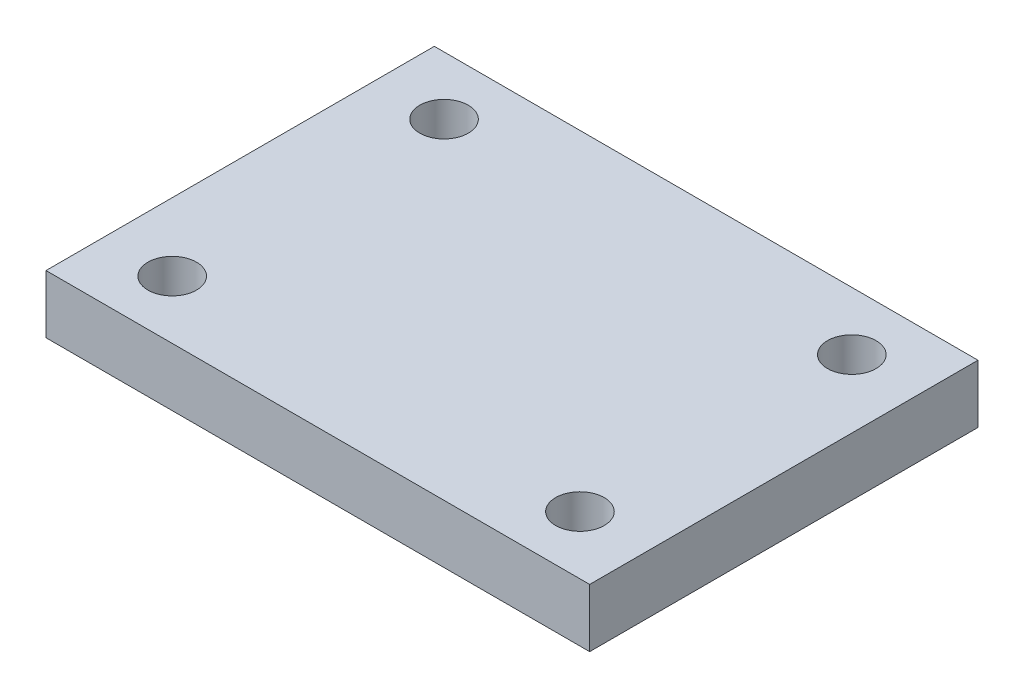
ISO-10303-21;
HEADER;
FILE_DESCRIPTION(('STEP AP214'),'2;1');
FILE_NAME('part.step','',(''),(''),'','','');
FILE_SCHEMA(('AUTOMOTIVE_DESIGN { 1 0 10303 214 1 1 1 1 }'));
ENDSEC;
DATA;
#1=APPLICATION_CONTEXT('core data for automotive mechanical design processes');
#2=APPLICATION_PROTOCOL_DEFINITION('international standard','automotive_design',2000,#1);
#3=PRODUCT_CONTEXT('',#1,'mechanical');
#4=PRODUCT('Part','Part','',(#3));
#5=PRODUCT_RELATED_PRODUCT_CATEGORY('part','',(#4));
#6=PRODUCT_DEFINITION_FORMATION('','',#4);
#7=PRODUCT_DEFINITION_CONTEXT('part definition',#1,'design');
#8=PRODUCT_DEFINITION('design','',#6,#7);
#9=PRODUCT_DEFINITION_SHAPE('','',#8);
#10=(LENGTH_UNIT() NAMED_UNIT(*) SI_UNIT(.MILLI.,.METRE.));
#11=(NAMED_UNIT(*) PLANE_ANGLE_UNIT() SI_UNIT($,.RADIAN.));
#12=(NAMED_UNIT(*) SI_UNIT($,.STERADIAN.) SOLID_ANGLE_UNIT());
#13=UNCERTAINTY_MEASURE_WITH_UNIT(LENGTH_MEASURE(1.E-05),#10,'distance_accuracy_value','');
#14=(GEOMETRIC_REPRESENTATION_CONTEXT(3) GLOBAL_UNCERTAINTY_ASSIGNED_CONTEXT((#13)) GLOBAL_UNIT_ASSIGNED_CONTEXT((#10,
#11,#12)) REPRESENTATION_CONTEXT('',''));
#15=CARTESIAN_POINT('',(0.,0.,0.));
#16=DIRECTION('',(0.,0.,1.));
#17=DIRECTION('',(1.,0.,0.));
#18=AXIS2_PLACEMENT_3D('',#15,#16,#17);
#19=CARTESIAN_POINT('',(14.,3.,-10.));
#20=DIRECTION('',(-1.,0.,0.));
#21=DIRECTION('',(0.,0.,1.));
#22=AXIS2_PLACEMENT_3D('',#19,#20,#21);
#23=PLANE('',#22);
#24=DIRECTION('',(0.,0.,-1.));
#25=VECTOR('',#24,1.);
#26=CARTESIAN_POINT('',(14.,0.,-10.));
#27=LINE('',#26,#25);
#28=CARTESIAN_POINT('',(14.,0.,10.));
#29=VERTEX_POINT('',#28);
#30=CARTESIAN_POINT('',(14.,0.,-10.));
#31=VERTEX_POINT('',#30);
#32=EDGE_CURVE('E110',#29,#31,#27,.T.);
#33=ORIENTED_EDGE('',*,*,#32,.T.);
#34=DIRECTION('',(0.,-1.,0.));
#35=VECTOR('',#34,1.);
#36=CARTESIAN_POINT('',(14.,3.,-10.));
#37=LINE('',#36,#35);
#38=CARTESIAN_POINT('',(14.,3.,-10.));
#39=VERTEX_POINT('',#38);
#40=EDGE_CURVE('E11',#39,#31,#37,.T.);
#41=ORIENTED_EDGE('',*,*,#40,.F.);
#42=DIRECTION('',(0.,0.,-1.));
#43=VECTOR('',#42,1.);
#44=CARTESIAN_POINT('',(14.,3.,-10.));
#45=LINE('',#44,#43);
#46=CARTESIAN_POINT('',(14.,3.,10.));
#47=VERTEX_POINT('',#46);
#48=EDGE_CURVE('E98',#47,#39,#45,.T.);
#49=ORIENTED_EDGE('',*,*,#48,.F.);
#50=DIRECTION('',(0.,-1.,0.));
#51=VECTOR('',#50,1.);
#52=CARTESIAN_POINT('',(14.,3.,10.));
#53=LINE('',#52,#51);
#54=EDGE_CURVE('E106',#47,#29,#53,.T.);
#55=ORIENTED_EDGE('',*,*,#54,.T.);
#56=EDGE_LOOP('',(#33,#41,#49,#55));
#57=FACE_BOUND('',#56,.T.);
#58=ADVANCED_FACE('F47',(#57),#23,.F.);
#59=CARTESIAN_POINT('',(-14.,3.,-10.));
#60=DIRECTION('',(0.,0.,1.));
#61=DIRECTION('',(1.,0.,0.));
#62=AXIS2_PLACEMENT_3D('',#59,#60,#61);
#63=PLANE('',#62);
#64=DIRECTION('',(-1.,0.,0.));
#65=VECTOR('',#64,1.);
#66=CARTESIAN_POINT('',(-14.,0.,-10.));
#67=LINE('',#66,#65);
#68=CARTESIAN_POINT('',(-14.,0.,-10.));
#69=VERTEX_POINT('',#68);
#70=EDGE_CURVE('E102',#31,#69,#67,.T.);
#71=ORIENTED_EDGE('',*,*,#70,.T.);
#72=DIRECTION('',(0.,-1.,0.));
#73=VECTOR('',#72,1.);
#74=CARTESIAN_POINT('',(-14.,3.,-10.));
#75=LINE('',#74,#73);
#76=CARTESIAN_POINT('',(-14.,3.,-10.));
#77=VERTEX_POINT('',#76);
#78=EDGE_CURVE('E55',#77,#69,#75,.T.);
#79=ORIENTED_EDGE('',*,*,#78,.F.);
#80=DIRECTION('',(-1.,0.,0.));
#81=VECTOR('',#80,1.);
#82=CARTESIAN_POINT('',(-14.,3.,-10.));
#83=LINE('',#82,#81);
#84=EDGE_CURVE('E93',#39,#77,#83,.T.);
#85=ORIENTED_EDGE('',*,*,#84,.F.);
#86=ORIENTED_EDGE('',*,*,#40,.T.);
#87=EDGE_LOOP('',(#71,#79,#85,#86));
#88=FACE_BOUND('',#87,.T.);
#89=ADVANCED_FACE('F101',(#88),#63,.F.);
#90=CARTESIAN_POINT('',(-14.,3.,-10.));
#91=DIRECTION('',(1.,0.,0.));
#92=DIRECTION('',(0.,0.,-1.));
#93=AXIS2_PLACEMENT_3D('',#90,#91,#92);
#94=PLANE('',#93);
#95=DIRECTION('',(0.,0.,1.));
#96=VECTOR('',#95,1.);
#97=CARTESIAN_POINT('',(-14.,0.,-10.));
#98=LINE('',#97,#96);
#99=CARTESIAN_POINT('',(-14.,0.,10.));
#100=VERTEX_POINT('',#99);
#101=EDGE_CURVE('E80',#69,#100,#98,.T.);
#102=ORIENTED_EDGE('',*,*,#101,.T.);
#103=DIRECTION('',(0.,-1.,0.));
#104=VECTOR('',#103,1.);
#105=CARTESIAN_POINT('',(-14.,3.,10.));
#106=LINE('',#105,#104);
#107=CARTESIAN_POINT('',(-14.,3.,10.));
#108=VERTEX_POINT('',#107);
#109=EDGE_CURVE('E103',#108,#100,#106,.T.);
#110=ORIENTED_EDGE('',*,*,#109,.F.);
#111=DIRECTION('',(0.,0.,1.));
#112=VECTOR('',#111,1.);
#113=CARTESIAN_POINT('',(-14.,3.,-10.));
#114=LINE('',#113,#112);
#115=EDGE_CURVE('E96',#77,#108,#114,.T.);
#116=ORIENTED_EDGE('',*,*,#115,.F.);
#117=ORIENTED_EDGE('',*,*,#78,.T.);
#118=EDGE_LOOP('',(#102,#110,#116,#117));
#119=FACE_BOUND('',#118,.T.);
#120=ADVANCED_FACE('F104',(#119),#94,.F.);
#121=CARTESIAN_POINT('',(-14.,3.,10.));
#122=DIRECTION('',(0.,0.,-1.));
#123=DIRECTION('',(-1.,0.,0.));
#124=AXIS2_PLACEMENT_3D('',#121,#122,#123);
#125=PLANE('',#124);
#126=DIRECTION('',(1.,0.,0.));
#127=VECTOR('',#126,1.);
#128=CARTESIAN_POINT('',(-14.,0.,10.));
#129=LINE('',#128,#127);
#130=EDGE_CURVE('E86',#100,#29,#129,.T.);
#131=ORIENTED_EDGE('',*,*,#130,.T.);
#132=ORIENTED_EDGE('',*,*,#54,.F.);
#133=DIRECTION('',(1.,0.,0.));
#134=VECTOR('',#133,1.);
#135=CARTESIAN_POINT('',(-14.,3.,10.));
#136=LINE('',#135,#134);
#137=EDGE_CURVE('E63',#108,#47,#136,.T.);
#138=ORIENTED_EDGE('',*,*,#137,.F.);
#139=ORIENTED_EDGE('',*,*,#109,.T.);
#140=EDGE_LOOP('',(#131,#132,#138,#139));
#141=FACE_BOUND('',#140,.T.);
#142=ADVANCED_FACE('F118',(#141),#125,.F.);
#143=CARTESIAN_POINT('',(0.,3.,0.));
#144=DIRECTION('',(0.,1.,0.));
#145=DIRECTION('',(0.,0.,1.));
#146=AXIS2_PLACEMENT_3D('',#143,#144,#145);
#147=PLANE('',#146);
#148=CARTESIAN_POINT('',(-10.5,3.,-7.));
#149=DIRECTION('',(0.,1.,0.));
#150=DIRECTION('',(0.,0.,1.));
#151=AXIS2_PLACEMENT_3D('',#148,#149,#150);
#152=CIRCLE('',#151,1.25);
#153=CARTESIAN_POINT('',(-10.5,3.,-5.75));
#154=VERTEX_POINT('',#153);
#155=EDGE_CURVE('E144',#154,#154,#152,.T.);
#156=ORIENTED_EDGE('',*,*,#155,.F.);
#157=EDGE_LOOP('',(#156));
#158=FACE_BOUND('',#157,.T.);
#159=CARTESIAN_POINT('',(-10.5,3.,7.));
#160=DIRECTION('',(0.,1.,0.));
#161=DIRECTION('',(0.,0.,1.));
#162=AXIS2_PLACEMENT_3D('',#159,#160,#161);
#163=CIRCLE('',#162,1.25);
#164=CARTESIAN_POINT('',(-10.5,3.,8.25));
#165=VERTEX_POINT('',#164);
#166=EDGE_CURVE('E138',#165,#165,#163,.T.);
#167=ORIENTED_EDGE('',*,*,#166,.F.);
#168=EDGE_LOOP('',(#167));
#169=FACE_BOUND('',#168,.T.);
#170=CARTESIAN_POINT('',(10.5,3.,7.));
#171=DIRECTION('',(0.,1.,0.));
#172=DIRECTION('',(0.,0.,1.));
#173=AXIS2_PLACEMENT_3D('',#170,#171,#172);
#174=CIRCLE('',#173,1.25);
#175=CARTESIAN_POINT('',(10.5,3.,8.25));
#176=VERTEX_POINT('',#175);
#177=EDGE_CURVE('E132',#176,#176,#174,.T.);
#178=ORIENTED_EDGE('',*,*,#177,.F.);
#179=EDGE_LOOP('',(#178));
#180=FACE_BOUND('',#179,.T.);
#181=CARTESIAN_POINT('',(10.5,3.,-7.));
#182=DIRECTION('',(0.,1.,0.));
#183=DIRECTION('',(0.,0.,1.));
#184=AXIS2_PLACEMENT_3D('',#181,#182,#183);
#185=CIRCLE('',#184,1.25);
#186=CARTESIAN_POINT('',(10.5,3.,-5.75));
#187=VERTEX_POINT('',#186);
#188=EDGE_CURVE('E126',#187,#187,#185,.T.);
#189=ORIENTED_EDGE('',*,*,#188,.F.);
#190=EDGE_LOOP('',(#189));
#191=FACE_BOUND('',#190,.T.);
#192=ORIENTED_EDGE('',*,*,#48,.T.);
#193=ORIENTED_EDGE('',*,*,#84,.T.);
#194=ORIENTED_EDGE('',*,*,#115,.T.);
#195=ORIENTED_EDGE('',*,*,#137,.T.);
#196=EDGE_LOOP('',(#192,#193,#194,#195));
#197=FACE_BOUND('',#196,.T.);
#198=ADVANCED_FACE('F94',(#158,#169,#180,#191,#197),#147,.T.);
#199=CARTESIAN_POINT('',(0.,0.,0.));
#200=DIRECTION('',(0.,1.,0.));
#201=DIRECTION('',(0.,0.,1.));
#202=AXIS2_PLACEMENT_3D('',#199,#200,#201);
#203=PLANE('',#202);
#204=CARTESIAN_POINT('',(-10.5,0.,-7.));
#205=DIRECTION('',(0.,1.,0.));
#206=DIRECTION('',(0.,0.,1.));
#207=AXIS2_PLACEMENT_3D('',#204,#205,#206);
#208=CIRCLE('',#207,1.25);
#209=CARTESIAN_POINT('',(-10.5,0.,-5.75));
#210=VERTEX_POINT('',#209);
#211=EDGE_CURVE('E141',#210,#210,#208,.T.);
#212=ORIENTED_EDGE('',*,*,#211,.T.);
#213=EDGE_LOOP('',(#212));
#214=FACE_BOUND('',#213,.T.);
#215=CARTESIAN_POINT('',(-10.5,0.,7.));
#216=DIRECTION('',(0.,1.,0.));
#217=DIRECTION('',(0.,0.,1.));
#218=AXIS2_PLACEMENT_3D('',#215,#216,#217);
#219=CIRCLE('',#218,1.25);
#220=CARTESIAN_POINT('',(-10.5,0.,8.25));
#221=VERTEX_POINT('',#220);
#222=EDGE_CURVE('E135',#221,#221,#219,.T.);
#223=ORIENTED_EDGE('',*,*,#222,.T.);
#224=EDGE_LOOP('',(#223));
#225=FACE_BOUND('',#224,.T.);
#226=CARTESIAN_POINT('',(10.5,0.,7.));
#227=DIRECTION('',(0.,1.,0.));
#228=DIRECTION('',(0.,0.,1.));
#229=AXIS2_PLACEMENT_3D('',#226,#227,#228);
#230=CIRCLE('',#229,1.25);
#231=CARTESIAN_POINT('',(10.5,0.,8.25));
#232=VERTEX_POINT('',#231);
#233=EDGE_CURVE('E129',#232,#232,#230,.T.);
#234=ORIENTED_EDGE('',*,*,#233,.T.);
#235=EDGE_LOOP('',(#234));
#236=FACE_BOUND('',#235,.T.);
#237=CARTESIAN_POINT('',(10.5,0.,-7.));
#238=DIRECTION('',(0.,1.,0.));
#239=DIRECTION('',(0.,0.,1.));
#240=AXIS2_PLACEMENT_3D('',#237,#238,#239);
#241=CIRCLE('',#240,1.25);
#242=CARTESIAN_POINT('',(10.5,0.,-5.75));
#243=VERTEX_POINT('',#242);
#244=EDGE_CURVE('E113',#243,#243,#241,.T.);
#245=ORIENTED_EDGE('',*,*,#244,.T.);
#246=EDGE_LOOP('',(#245));
#247=FACE_BOUND('',#246,.T.);
#248=ORIENTED_EDGE('',*,*,#32,.F.);
#249=ORIENTED_EDGE('',*,*,#130,.F.);
#250=ORIENTED_EDGE('',*,*,#101,.F.);
#251=ORIENTED_EDGE('',*,*,#70,.F.);
#252=EDGE_LOOP('',(#248,#249,#250,#251));
#253=FACE_BOUND('',#252,.T.);
#254=ADVANCED_FACE('F121',(#214,#225,#236,#247,#253),#203,.F.);
#255=CARTESIAN_POINT('',(10.5,3.,-7.));
#256=DIRECTION('',(0.,1.,0.));
#257=DIRECTION('',(0.,0.,1.));
#258=AXIS2_PLACEMENT_3D('',#255,#256,#257);
#259=CYLINDRICAL_SURFACE('',#258,1.25);
#260=ORIENTED_EDGE('',*,*,#244,.F.);
#261=EDGE_LOOP('',(#260));
#262=FACE_BOUND('',#261,.T.);
#263=ORIENTED_EDGE('',*,*,#188,.T.);
#264=EDGE_LOOP('',(#263));
#265=FACE_BOUND('',#264,.T.);
#266=ADVANCED_FACE('F159',(#262,#265),#259,.F.);
#267=CARTESIAN_POINT('',(10.5,3.,7.));
#268=DIRECTION('',(0.,1.,0.));
#269=DIRECTION('',(0.,0.,1.));
#270=AXIS2_PLACEMENT_3D('',#267,#268,#269);
#271=CYLINDRICAL_SURFACE('',#270,1.25);
#272=ORIENTED_EDGE('',*,*,#233,.F.);
#273=EDGE_LOOP('',(#272));
#274=FACE_BOUND('',#273,.T.);
#275=ORIENTED_EDGE('',*,*,#177,.T.);
#276=EDGE_LOOP('',(#275));
#277=FACE_BOUND('',#276,.T.);
#278=ADVANCED_FACE('F161',(#274,#277),#271,.F.);
#279=CARTESIAN_POINT('',(-10.5,3.,7.));
#280=DIRECTION('',(0.,1.,0.));
#281=DIRECTION('',(0.,0.,1.));
#282=AXIS2_PLACEMENT_3D('',#279,#280,#281);
#283=CYLINDRICAL_SURFACE('',#282,1.25);
#284=ORIENTED_EDGE('',*,*,#222,.F.);
#285=EDGE_LOOP('',(#284));
#286=FACE_BOUND('',#285,.T.);
#287=ORIENTED_EDGE('',*,*,#166,.T.);
#288=EDGE_LOOP('',(#287));
#289=FACE_BOUND('',#288,.T.);
#290=ADVANCED_FACE('F167',(#286,#289),#283,.F.);
#291=CARTESIAN_POINT('',(-10.5,3.,-7.));
#292=DIRECTION('',(0.,1.,0.));
#293=DIRECTION('',(0.,0.,1.));
#294=AXIS2_PLACEMENT_3D('',#291,#292,#293);
#295=CYLINDRICAL_SURFACE('',#294,1.25);
#296=ORIENTED_EDGE('',*,*,#211,.F.);
#297=EDGE_LOOP('',(#296));
#298=FACE_BOUND('',#297,.T.);
#299=ORIENTED_EDGE('',*,*,#155,.T.);
#300=EDGE_LOOP('',(#299));
#301=FACE_BOUND('',#300,.T.);
#302=ADVANCED_FACE('F148',(#298,#301),#295,.F.);
#303=CLOSED_SHELL('',(#58,#89,#120,#142,#198,#254,#266,#278,#290,#302));
#304=MANIFOLD_SOLID_BREP('B2',#303);
#305=ADVANCED_BREP_SHAPE_REPRESENTATION('',(#18,#304),#14);
#306=SHAPE_DEFINITION_REPRESENTATION(#9,#305);
ENDSEC;
END-ISO-10303-21;
